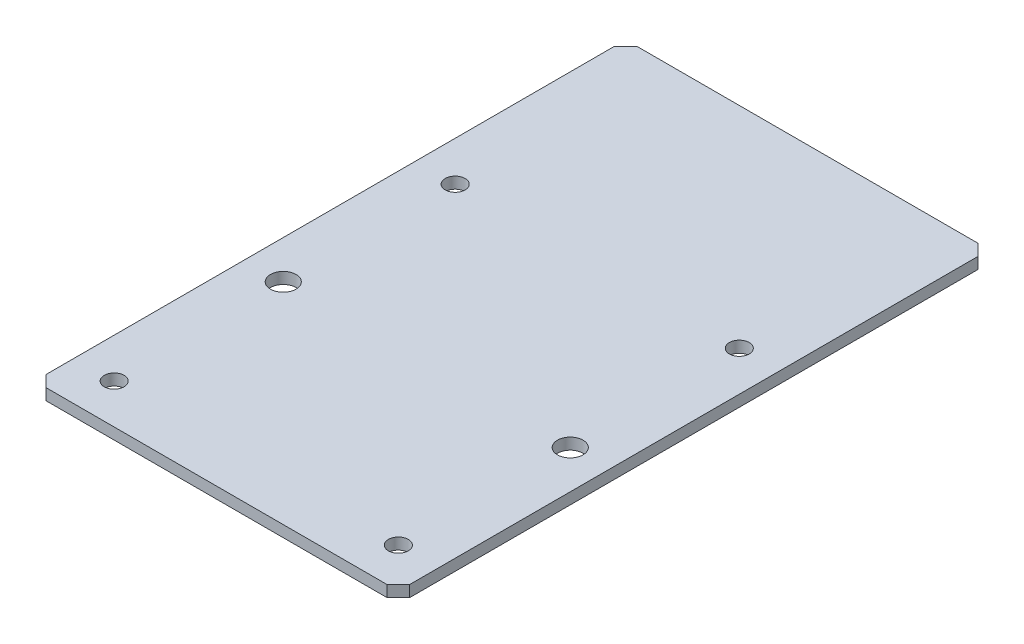
ISO-10303-21;
HEADER;
FILE_DESCRIPTION(('STEP AP214'),'2;1');
FILE_NAME('part.step','',(''),(''),'','','');
FILE_SCHEMA(('AUTOMOTIVE_DESIGN { 1 0 10303 214 1 1 1 1 }'));
ENDSEC;
DATA;
#1=APPLICATION_CONTEXT('core data for automotive mechanical design processes');
#2=APPLICATION_PROTOCOL_DEFINITION('international standard','automotive_design',2000,#1);
#3=PRODUCT_CONTEXT('',#1,'mechanical');
#4=PRODUCT('Part','Part','',(#3));
#5=PRODUCT_RELATED_PRODUCT_CATEGORY('part','',(#4));
#6=PRODUCT_DEFINITION_FORMATION('','',#4);
#7=PRODUCT_DEFINITION_CONTEXT('part definition',#1,'design');
#8=PRODUCT_DEFINITION('design','',#6,#7);
#9=PRODUCT_DEFINITION_SHAPE('','',#8);
#10=(LENGTH_UNIT() NAMED_UNIT(*) SI_UNIT(.MILLI.,.METRE.));
#11=(NAMED_UNIT(*) PLANE_ANGLE_UNIT() SI_UNIT($,.RADIAN.));
#12=(NAMED_UNIT(*) SI_UNIT($,.STERADIAN.) SOLID_ANGLE_UNIT());
#13=UNCERTAINTY_MEASURE_WITH_UNIT(LENGTH_MEASURE(1.E-05),#10,'distance_accuracy_value','');
#14=(GEOMETRIC_REPRESENTATION_CONTEXT(3) GLOBAL_UNCERTAINTY_ASSIGNED_CONTEXT((#13)) GLOBAL_UNIT_ASSIGNED_CONTEXT((#10,
#11,#12)) REPRESENTATION_CONTEXT('',''));
#15=CARTESIAN_POINT('',(0.,0.,0.));
#16=DIRECTION('',(0.,0.,1.));
#17=DIRECTION('',(1.,0.,0.));
#18=AXIS2_PLACEMENT_3D('',#15,#16,#17);
#19=CARTESIAN_POINT('',(-32.,-2.,74.));
#20=DIRECTION('',(0.,1.,0.));
#21=DIRECTION('',(0.,0.,1.));
#22=AXIS2_PLACEMENT_3D('',#19,#20,#21);
#23=PLANE('',#22);
#24=CARTESIAN_POINT('',(25.25,-2.,37.));
#25=DIRECTION('',(0.,1.,0.));
#26=DIRECTION('',(0.,0.,1.));
#27=AXIS2_PLACEMENT_3D('',#24,#25,#26);
#28=CIRCLE('',#27,2.25);
#29=CARTESIAN_POINT('',(25.25,-2.,39.25));
#30=VERTEX_POINT('',#29);
#31=EDGE_CURVE('E291',#30,#30,#28,.F.);
#32=ORIENTED_EDGE('',*,*,#31,.F.);
#33=EDGE_LOOP('',(#32));
#34=FACE_BOUND('',#33,.T.);
#35=CARTESIAN_POINT('',(-25.25,-2.,37.));
#36=DIRECTION('',(0.,1.,0.));
#37=DIRECTION('',(0.,0.,1.));
#38=AXIS2_PLACEMENT_3D('',#35,#36,#37);
#39=CIRCLE('',#38,2.25);
#40=CARTESIAN_POINT('',(-25.25,-2.,39.25));
#41=VERTEX_POINT('',#40);
#42=EDGE_CURVE('E161',#41,#41,#39,.F.);
#43=ORIENTED_EDGE('',*,*,#42,.F.);
#44=EDGE_LOOP('',(#43));
#45=FACE_BOUND('',#44,.T.);
#46=CARTESIAN_POINT('',(25.,-2.,7.00000000000001));
#47=DIRECTION('',(0.,1.,0.));
#48=DIRECTION('',(0.,0.,1.));
#49=AXIS2_PLACEMENT_3D('',#46,#47,#48);
#50=CIRCLE('',#49,1.75);
#51=CARTESIAN_POINT('',(25.,-2.,8.75000000000001));
#52=VERTEX_POINT('',#51);
#53=EDGE_CURVE('E171',#52,#52,#50,.T.);
#54=ORIENTED_EDGE('',*,*,#53,.T.);
#55=EDGE_LOOP('',(#54));
#56=FACE_BOUND('',#55,.T.);
#57=CARTESIAN_POINT('',(25.,-2.,67.));
#58=DIRECTION('',(0.,1.,0.));
#59=DIRECTION('',(0.,0.,1.));
#60=AXIS2_PLACEMENT_3D('',#57,#58,#59);
#61=CIRCLE('',#60,1.75);
#62=CARTESIAN_POINT('',(25.,-2.,68.75));
#63=VERTEX_POINT('',#62);
#64=EDGE_CURVE('E177',#63,#63,#61,.T.);
#65=ORIENTED_EDGE('',*,*,#64,.T.);
#66=EDGE_LOOP('',(#65));
#67=FACE_BOUND('',#66,.T.);
#68=CARTESIAN_POINT('',(-25.,-2.,67.));
#69=DIRECTION('',(0.,1.,0.));
#70=DIRECTION('',(0.,0.,1.));
#71=AXIS2_PLACEMENT_3D('',#68,#69,#70);
#72=CIRCLE('',#71,1.75);
#73=CARTESIAN_POINT('',(-25.,-2.,68.75));
#74=VERTEX_POINT('',#73);
#75=EDGE_CURVE('E183',#74,#74,#72,.T.);
#76=ORIENTED_EDGE('',*,*,#75,.T.);
#77=EDGE_LOOP('',(#76));
#78=FACE_BOUND('',#77,.T.);
#79=CARTESIAN_POINT('',(-25.,-2.,7.00000000000001));
#80=DIRECTION('',(0.,1.,0.));
#81=DIRECTION('',(0.,0.,1.));
#82=AXIS2_PLACEMENT_3D('',#79,#80,#81);
#83=CIRCLE('',#82,1.75);
#84=CARTESIAN_POINT('',(-25.,-2.,8.75000000000001));
#85=VERTEX_POINT('',#84);
#86=EDGE_CURVE('E189',#85,#85,#83,.T.);
#87=ORIENTED_EDGE('',*,*,#86,.T.);
#88=EDGE_LOOP('',(#87));
#89=FACE_BOUND('',#88,.T.);
#90=DIRECTION('',(-1.,0.,0.));
#91=VECTOR('',#90,1.);
#92=CARTESIAN_POINT('',(-32.,-2.,-30.));
#93=LINE('',#92,#91);
#94=CARTESIAN_POINT('',(30.,-2.,-30.));
#95=VERTEX_POINT('',#94);
#96=CARTESIAN_POINT('',(-30.,-2.,-30.));
#97=VERTEX_POINT('',#96);
#98=EDGE_CURVE('E151',#95,#97,#93,.T.);
#99=ORIENTED_EDGE('',*,*,#98,.F.);
#100=DIRECTION('',(-0.707106781186548,0.,-0.707106781186548));
#101=VECTOR('',#100,1.);
#102=CARTESIAN_POINT('',(32.,-2.,-28.));
#103=LINE('',#102,#101);
#104=CARTESIAN_POINT('',(32.,-2.,-28.));
#105=VERTEX_POINT('',#104);
#106=EDGE_CURVE('E42',#95,#105,#103,.F.);
#107=ORIENTED_EDGE('',*,*,#106,.T.);
#108=DIRECTION('',(0.,0.,-1.));
#109=VECTOR('',#108,1.);
#110=CARTESIAN_POINT('',(32.,-2.,74.));
#111=LINE('',#110,#109);
#112=CARTESIAN_POINT('',(32.,-2.,72.));
#113=VERTEX_POINT('',#112);
#114=EDGE_CURVE('E122',#113,#105,#111,.T.);
#115=ORIENTED_EDGE('',*,*,#114,.F.);
#116=DIRECTION('',(-0.70710678118655,0.,0.707106781186545));
#117=VECTOR('',#116,1.);
#118=CARTESIAN_POINT('',(32.,-2.,72.));
#119=LINE('',#118,#117);
#120=CARTESIAN_POINT('',(30.,-2.,74.));
#121=VERTEX_POINT('',#120);
#122=EDGE_CURVE('E126',#113,#121,#119,.T.);
#123=ORIENTED_EDGE('',*,*,#122,.T.);
#124=DIRECTION('',(1.,0.,0.));
#125=VECTOR('',#124,1.);
#126=CARTESIAN_POINT('',(-32.,-2.,74.));
#127=LINE('',#126,#125);
#128=CARTESIAN_POINT('',(-30.,-2.,74.));
#129=VERTEX_POINT('',#128);
#130=EDGE_CURVE('E192',#129,#121,#127,.T.);
#131=ORIENTED_EDGE('',*,*,#130,.F.);
#132=DIRECTION('',(-0.70710678118655,0.,-0.707106781186545));
#133=VECTOR('',#132,1.);
#134=CARTESIAN_POINT('',(-32.,-2.,72.));
#135=LINE('',#134,#133);
#136=CARTESIAN_POINT('',(-32.,-2.,72.));
#137=VERTEX_POINT('',#136);
#138=EDGE_CURVE('E127',#129,#137,#135,.T.);
#139=ORIENTED_EDGE('',*,*,#138,.T.);
#140=DIRECTION('',(0.,0.,-1.));
#141=VECTOR('',#140,1.);
#142=CARTESIAN_POINT('',(-32.,-2.,74.));
#143=LINE('',#142,#141);
#144=CARTESIAN_POINT('',(-32.,-2.,-28.));
#145=VERTEX_POINT('',#144);
#146=EDGE_CURVE('E196',#137,#145,#143,.T.);
#147=ORIENTED_EDGE('',*,*,#146,.T.);
#148=DIRECTION('',(-0.707106781186548,0.,0.707106781186548));
#149=VECTOR('',#148,1.);
#150=CARTESIAN_POINT('',(-30.,-2.,-30.));
#151=LINE('',#150,#149);
#152=EDGE_CURVE('E54',#145,#97,#151,.F.);
#153=ORIENTED_EDGE('',*,*,#152,.T.);
#154=EDGE_LOOP('',(#99,#107,#115,#123,#131,#139,#147,#153));
#155=FACE_BOUND('',#154,.T.);
#156=ADVANCED_FACE('F34',(#34,#45,#56,#67,#78,#89,#155),#23,.F.);
#157=CARTESIAN_POINT('',(32.,0.,74.));
#158=DIRECTION('',(1.,0.,0.));
#159=DIRECTION('',(0.,0.,-1.));
#160=AXIS2_PLACEMENT_3D('',#157,#158,#159);
#161=PLANE('',#160);
#162=ORIENTED_EDGE('',*,*,#114,.T.);
#163=DIRECTION('',(0.,1.,0.));
#164=VECTOR('',#163,1.);
#165=CARTESIAN_POINT('',(32.,0.,-28.));
#166=LINE('',#165,#164);
#167=CARTESIAN_POINT('',(32.,0.,-28.));
#168=VERTEX_POINT('',#167);
#169=EDGE_CURVE('E121',#105,#168,#166,.T.);
#170=ORIENTED_EDGE('',*,*,#169,.T.);
#171=DIRECTION('',(0.,0.,-1.));
#172=VECTOR('',#171,1.);
#173=CARTESIAN_POINT('',(32.,0.,74.));
#174=LINE('',#173,#172);
#175=CARTESIAN_POINT('',(32.,0.,72.));
#176=VERTEX_POINT('',#175);
#177=EDGE_CURVE('E104',#176,#168,#174,.T.);
#178=ORIENTED_EDGE('',*,*,#177,.F.);
#179=DIRECTION('',(0.,-1.,0.));
#180=VECTOR('',#179,1.);
#181=CARTESIAN_POINT('',(32.,-2.,72.));
#182=LINE('',#181,#180);
#183=EDGE_CURVE('E118',#176,#113,#182,.T.);
#184=ORIENTED_EDGE('',*,*,#183,.T.);
#185=EDGE_LOOP('',(#162,#170,#178,#184));
#186=FACE_BOUND('',#185,.T.);
#187=ADVANCED_FACE('F117',(#186),#161,.T.);
#188=CARTESIAN_POINT('',(-32.,0.,74.));
#189=DIRECTION('',(0.,1.,0.));
#190=DIRECTION('',(0.,0.,1.));
#191=AXIS2_PLACEMENT_3D('',#188,#189,#190);
#192=PLANE('',#191);
#193=CARTESIAN_POINT('',(25.25,0.,37.));
#194=DIRECTION('',(0.,1.,0.));
#195=DIRECTION('',(0.,0.,1.));
#196=AXIS2_PLACEMENT_3D('',#193,#194,#195);
#197=CIRCLE('',#196,2.25);
#198=CARTESIAN_POINT('',(25.25,0.,39.25));
#199=VERTEX_POINT('',#198);
#200=EDGE_CURVE('E256',#199,#199,#197,.T.);
#201=ORIENTED_EDGE('',*,*,#200,.F.);
#202=EDGE_LOOP('',(#201));
#203=FACE_BOUND('',#202,.T.);
#204=CARTESIAN_POINT('',(-25.25,0.,37.));
#205=DIRECTION('',(0.,1.,0.));
#206=DIRECTION('',(0.,0.,1.));
#207=AXIS2_PLACEMENT_3D('',#204,#205,#206);
#208=CIRCLE('',#207,2.25);
#209=CARTESIAN_POINT('',(-25.25,0.,39.25));
#210=VERTEX_POINT('',#209);
#211=EDGE_CURVE('E166',#210,#210,#208,.T.);
#212=ORIENTED_EDGE('',*,*,#211,.F.);
#213=EDGE_LOOP('',(#212));
#214=FACE_BOUND('',#213,.T.);
#215=CARTESIAN_POINT('',(25.,0.,7.00000000000001));
#216=DIRECTION('',(0.,1.,0.));
#217=DIRECTION('',(0.,0.,-1.));
#218=AXIS2_PLACEMENT_3D('',#215,#216,#217);
#219=CIRCLE('',#218,1.75);
#220=CARTESIAN_POINT('',(25.,0.,5.25000000000001));
#221=VERTEX_POINT('',#220);
#222=EDGE_CURVE('E163',#221,#221,#219,.T.);
#223=ORIENTED_EDGE('',*,*,#222,.F.);
#224=EDGE_LOOP('',(#223));
#225=FACE_BOUND('',#224,.T.);
#226=CARTESIAN_POINT('',(25.,0.,67.));
#227=DIRECTION('',(0.,1.,0.));
#228=DIRECTION('',(0.,0.,1.));
#229=AXIS2_PLACEMENT_3D('',#226,#227,#228);
#230=CIRCLE('',#229,1.75);
#231=CARTESIAN_POINT('',(25.,0.,68.75));
#232=VERTEX_POINT('',#231);
#233=EDGE_CURVE('E174',#232,#232,#230,.T.);
#234=ORIENTED_EDGE('',*,*,#233,.F.);
#235=EDGE_LOOP('',(#234));
#236=FACE_BOUND('',#235,.T.);
#237=CARTESIAN_POINT('',(-25.,0.,67.));
#238=DIRECTION('',(0.,1.,0.));
#239=DIRECTION('',(0.,0.,-1.));
#240=AXIS2_PLACEMENT_3D('',#237,#238,#239);
#241=CIRCLE('',#240,1.75);
#242=CARTESIAN_POINT('',(-25.,0.,65.25));
#243=VERTEX_POINT('',#242);
#244=EDGE_CURVE('E180',#243,#243,#241,.T.);
#245=ORIENTED_EDGE('',*,*,#244,.F.);
#246=EDGE_LOOP('',(#245));
#247=FACE_BOUND('',#246,.T.);
#248=CARTESIAN_POINT('',(-25.,0.,7.00000000000001));
#249=DIRECTION('',(0.,1.,0.));
#250=DIRECTION('',(0.,0.,1.));
#251=AXIS2_PLACEMENT_3D('',#248,#249,#250);
#252=CIRCLE('',#251,1.75);
#253=CARTESIAN_POINT('',(-25.,0.,8.75000000000001));
#254=VERTEX_POINT('',#253);
#255=EDGE_CURVE('E186',#254,#254,#252,.T.);
#256=ORIENTED_EDGE('',*,*,#255,.F.);
#257=EDGE_LOOP('',(#256));
#258=FACE_BOUND('',#257,.T.);
#259=ORIENTED_EDGE('',*,*,#177,.T.);
#260=DIRECTION('',(0.707106781186548,0.,0.707106781186548));
#261=VECTOR('',#260,1.);
#262=CARTESIAN_POINT('',(51.,0.,-9.00000000000001));
#263=LINE('',#262,#261);
#264=CARTESIAN_POINT('',(30.,0.,-30.));
#265=VERTEX_POINT('',#264);
#266=EDGE_CURVE('E143',#168,#265,#263,.F.);
#267=ORIENTED_EDGE('',*,*,#266,.T.);
#268=DIRECTION('',(-1.,0.,0.));
#269=VECTOR('',#268,1.);
#270=CARTESIAN_POINT('',(-32.,0.,-30.));
#271=LINE('',#270,#269);
#272=CARTESIAN_POINT('',(-30.,0.,-30.));
#273=VERTEX_POINT('',#272);
#274=EDGE_CURVE('E157',#265,#273,#271,.T.);
#275=ORIENTED_EDGE('',*,*,#274,.T.);
#276=DIRECTION('',(0.707106781186548,0.,-0.707106781186548));
#277=VECTOR('',#276,1.);
#278=CARTESIAN_POINT('',(-83.,0.,23.));
#279=LINE('',#278,#277);
#280=CARTESIAN_POINT('',(-32.,0.,-28.));
#281=VERTEX_POINT('',#280);
#282=EDGE_CURVE('E141',#273,#281,#279,.F.);
#283=ORIENTED_EDGE('',*,*,#282,.T.);
#284=DIRECTION('',(0.,0.,-1.));
#285=VECTOR('',#284,1.);
#286=CARTESIAN_POINT('',(-32.,0.,74.));
#287=LINE('',#286,#285);
#288=CARTESIAN_POINT('',(-32.,0.,72.));
#289=VERTEX_POINT('',#288);
#290=EDGE_CURVE('E123',#289,#281,#287,.T.);
#291=ORIENTED_EDGE('',*,*,#290,.F.);
#292=DIRECTION('',(0.70710678118655,0.,0.707106781186545));
#293=VECTOR('',#292,1.);
#294=CARTESIAN_POINT('',(-31.,0.,73.));
#295=LINE('',#294,#293);
#296=CARTESIAN_POINT('',(-30.,0.,74.));
#297=VERTEX_POINT('',#296);
#298=EDGE_CURVE('E111',#289,#297,#295,.T.);
#299=ORIENTED_EDGE('',*,*,#298,.T.);
#300=DIRECTION('',(1.,0.,0.));
#301=VECTOR('',#300,1.);
#302=CARTESIAN_POINT('',(-32.,0.,74.));
#303=LINE('',#302,#301);
#304=CARTESIAN_POINT('',(30.,0.,74.));
#305=VERTEX_POINT('',#304);
#306=EDGE_CURVE('E106',#297,#305,#303,.T.);
#307=ORIENTED_EDGE('',*,*,#306,.T.);
#308=DIRECTION('',(0.70710678118655,0.,-0.707106781186545));
#309=VECTOR('',#308,1.);
#310=CARTESIAN_POINT('',(-1.00000000000023,0.,105.));
#311=LINE('',#310,#309);
#312=EDGE_CURVE('E101',#305,#176,#311,.T.);
#313=ORIENTED_EDGE('',*,*,#312,.T.);
#314=EDGE_LOOP('',(#259,#267,#275,#283,#291,#299,#307,#313));
#315=FACE_BOUND('',#314,.T.);
#316=ADVANCED_FACE('F103',(#203,#214,#225,#236,#247,#258,#315),#192,.T.);
#317=CARTESIAN_POINT('',(-32.,-2.,74.));
#318=DIRECTION('',(-1.,0.,0.));
#319=DIRECTION('',(0.,0.,1.));
#320=AXIS2_PLACEMENT_3D('',#317,#318,#319);
#321=PLANE('',#320);
#322=ORIENTED_EDGE('',*,*,#290,.T.);
#323=DIRECTION('',(0.,-1.,0.));
#324=VECTOR('',#323,1.);
#325=CARTESIAN_POINT('',(-32.,-2.,-28.));
#326=LINE('',#325,#324);
#327=EDGE_CURVE('E11',#281,#145,#326,.T.);
#328=ORIENTED_EDGE('',*,*,#327,.T.);
#329=ORIENTED_EDGE('',*,*,#146,.F.);
#330=DIRECTION('',(0.,1.,0.));
#331=VECTOR('',#330,1.);
#332=CARTESIAN_POINT('',(-32.,0.,72.));
#333=LINE('',#332,#331);
#334=EDGE_CURVE('E110',#137,#289,#333,.T.);
#335=ORIENTED_EDGE('',*,*,#334,.T.);
#336=EDGE_LOOP('',(#322,#328,#329,#335));
#337=FACE_BOUND('',#336,.T.);
#338=ADVANCED_FACE('F199',(#337),#321,.T.);
#339=CARTESIAN_POINT('',(32.,-2.,74.));
#340=DIRECTION('',(0.,0.,-1.));
#341=DIRECTION('',(-1.,0.,0.));
#342=AXIS2_PLACEMENT_3D('',#339,#340,#341);
#343=PLANE('',#342);
#344=ORIENTED_EDGE('',*,*,#130,.T.);
#345=DIRECTION('',(0.,1.,0.));
#346=VECTOR('',#345,1.);
#347=CARTESIAN_POINT('',(30.,0.,74.));
#348=LINE('',#347,#346);
#349=EDGE_CURVE('E135',#121,#305,#348,.T.);
#350=ORIENTED_EDGE('',*,*,#349,.T.);
#351=ORIENTED_EDGE('',*,*,#306,.F.);
#352=DIRECTION('',(0.,-1.,0.));
#353=VECTOR('',#352,1.);
#354=CARTESIAN_POINT('',(-30.,-2.,74.));
#355=LINE('',#354,#353);
#356=EDGE_CURVE('E133',#297,#129,#355,.T.);
#357=ORIENTED_EDGE('',*,*,#356,.T.);
#358=EDGE_LOOP('',(#344,#350,#351,#357));
#359=FACE_BOUND('',#358,.T.);
#360=ADVANCED_FACE('F236',(#359),#343,.F.);
#361=CARTESIAN_POINT('',(-25.,-10.,7.00000000000001));
#362=DIRECTION('',(0.,1.,0.));
#363=DIRECTION('',(0.,0.,1.));
#364=AXIS2_PLACEMENT_3D('',#361,#362,#363);
#365=CYLINDRICAL_SURFACE('',#364,1.75);
#366=ORIENTED_EDGE('',*,*,#255,.T.);
#367=EDGE_LOOP('',(#366));
#368=FACE_BOUND('',#367,.T.);
#369=ORIENTED_EDGE('',*,*,#86,.F.);
#370=EDGE_LOOP('',(#369));
#371=FACE_BOUND('',#370,.T.);
#372=ADVANCED_FACE('F238',(#368,#371),#365,.F.);
#373=CARTESIAN_POINT('',(-25.,-10.,67.));
#374=DIRECTION('',(0.,1.,0.));
#375=DIRECTION('',(0.,0.,1.));
#376=AXIS2_PLACEMENT_3D('',#373,#374,#375);
#377=CYLINDRICAL_SURFACE('',#376,1.75);
#378=ORIENTED_EDGE('',*,*,#244,.T.);
#379=EDGE_LOOP('',(#378));
#380=FACE_BOUND('',#379,.T.);
#381=ORIENTED_EDGE('',*,*,#75,.F.);
#382=EDGE_LOOP('',(#381));
#383=FACE_BOUND('',#382,.T.);
#384=ADVANCED_FACE('F244',(#380,#383),#377,.F.);
#385=CARTESIAN_POINT('',(25.,-10.,67.));
#386=DIRECTION('',(0.,1.,0.));
#387=DIRECTION('',(0.,0.,1.));
#388=AXIS2_PLACEMENT_3D('',#385,#386,#387);
#389=CYLINDRICAL_SURFACE('',#388,1.75);
#390=ORIENTED_EDGE('',*,*,#233,.T.);
#391=EDGE_LOOP('',(#390));
#392=FACE_BOUND('',#391,.T.);
#393=ORIENTED_EDGE('',*,*,#64,.F.);
#394=EDGE_LOOP('',(#393));
#395=FACE_BOUND('',#394,.T.);
#396=ADVANCED_FACE('F273',(#392,#395),#389,.F.);
#397=CARTESIAN_POINT('',(25.,-10.,7.00000000000001));
#398=DIRECTION('',(0.,1.,0.));
#399=DIRECTION('',(0.,0.,1.));
#400=AXIS2_PLACEMENT_3D('',#397,#398,#399);
#401=CYLINDRICAL_SURFACE('',#400,1.75);
#402=ORIENTED_EDGE('',*,*,#222,.T.);
#403=EDGE_LOOP('',(#402));
#404=FACE_BOUND('',#403,.T.);
#405=ORIENTED_EDGE('',*,*,#53,.F.);
#406=EDGE_LOOP('',(#405));
#407=FACE_BOUND('',#406,.T.);
#408=ADVANCED_FACE('F225',(#404,#407),#401,.F.);
#409=CARTESIAN_POINT('',(32.,0.,72.));
#410=DIRECTION('',(0.707106781186545,0.,0.70710678118655));
#411=DIRECTION('',(0.70710678118655,0.,-0.707106781186545));
#412=AXIS2_PLACEMENT_3D('',#409,#410,#411);
#413=PLANE('',#412);
#414=ORIENTED_EDGE('',*,*,#312,.F.);
#415=ORIENTED_EDGE('',*,*,#349,.F.);
#416=ORIENTED_EDGE('',*,*,#122,.F.);
#417=ORIENTED_EDGE('',*,*,#183,.F.);
#418=EDGE_LOOP('',(#414,#415,#416,#417));
#419=FACE_BOUND('',#418,.T.);
#420=ADVANCED_FACE('F125',(#419),#413,.T.);
#421=CARTESIAN_POINT('',(-32.,-2.,72.));
#422=DIRECTION('',(-0.707106781186545,0.,0.70710678118655));
#423=DIRECTION('',(0.70710678118655,0.,0.707106781186545));
#424=AXIS2_PLACEMENT_3D('',#421,#422,#423);
#425=PLANE('',#424);
#426=ORIENTED_EDGE('',*,*,#138,.F.);
#427=ORIENTED_EDGE('',*,*,#356,.F.);
#428=ORIENTED_EDGE('',*,*,#298,.F.);
#429=ORIENTED_EDGE('',*,*,#334,.F.);
#430=EDGE_LOOP('',(#426,#427,#428,#429));
#431=FACE_BOUND('',#430,.T.);
#432=ADVANCED_FACE('F224',(#431),#425,.T.);
#433=CARTESIAN_POINT('',(-32.,-2.,-30.));
#434=DIRECTION('',(0.,0.,-1.));
#435=DIRECTION('',(-1.,0.,0.));
#436=AXIS2_PLACEMENT_3D('',#433,#434,#435);
#437=PLANE('',#436);
#438=ORIENTED_EDGE('',*,*,#274,.F.);
#439=DIRECTION('',(0.,-1.,0.));
#440=VECTOR('',#439,1.);
#441=CARTESIAN_POINT('',(30.,-2.,-30.));
#442=LINE('',#441,#440);
#443=EDGE_CURVE('E148',#265,#95,#442,.T.);
#444=ORIENTED_EDGE('',*,*,#443,.T.);
#445=ORIENTED_EDGE('',*,*,#98,.T.);
#446=DIRECTION('',(0.,1.,0.));
#447=VECTOR('',#446,1.);
#448=CARTESIAN_POINT('',(-30.,-2.,-30.));
#449=LINE('',#448,#447);
#450=EDGE_CURVE('E145',#97,#273,#449,.T.);
#451=ORIENTED_EDGE('',*,*,#450,.T.);
#452=EDGE_LOOP('',(#438,#444,#445,#451));
#453=FACE_BOUND('',#452,.T.);
#454=ADVANCED_FACE('F159',(#453),#437,.T.);
#455=CARTESIAN_POINT('',(32.,0.,-28.));
#456=DIRECTION('',(-0.707106781186547,0.,0.707106781186547));
#457=DIRECTION('',(0.707106781186548,0.,0.707106781186548));
#458=AXIS2_PLACEMENT_3D('',#455,#456,#457);
#459=PLANE('',#458);
#460=ORIENTED_EDGE('',*,*,#106,.F.);
#461=ORIENTED_EDGE('',*,*,#443,.F.);
#462=ORIENTED_EDGE('',*,*,#266,.F.);
#463=ORIENTED_EDGE('',*,*,#169,.F.);
#464=EDGE_LOOP('',(#460,#461,#462,#463));
#465=FACE_BOUND('',#464,.T.);
#466=ADVANCED_FACE('F154',(#465),#459,.F.);
#467=CARTESIAN_POINT('',(-30.,-2.,-30.));
#468=DIRECTION('',(0.707106781186547,0.,0.707106781186547));
#469=DIRECTION('',(0.707106781186548,0.,-0.707106781186548));
#470=AXIS2_PLACEMENT_3D('',#467,#468,#469);
#471=PLANE('',#470);
#472=ORIENTED_EDGE('',*,*,#152,.F.);
#473=ORIENTED_EDGE('',*,*,#327,.F.);
#474=ORIENTED_EDGE('',*,*,#282,.F.);
#475=ORIENTED_EDGE('',*,*,#450,.F.);
#476=EDGE_LOOP('',(#472,#473,#474,#475));
#477=FACE_BOUND('',#476,.T.);
#478=ADVANCED_FACE('F36',(#477),#471,.F.);
#479=CARTESIAN_POINT('',(-25.25,-2.001,37.));
#480=DIRECTION('',(0.,1.,0.));
#481=DIRECTION('',(0.,0.,1.));
#482=AXIS2_PLACEMENT_3D('',#479,#480,#481);
#483=CYLINDRICAL_SURFACE('',#482,2.25);
#484=ORIENTED_EDGE('',*,*,#211,.T.);
#485=EDGE_LOOP('',(#484));
#486=FACE_BOUND('',#485,.T.);
#487=ORIENTED_EDGE('',*,*,#42,.T.);
#488=EDGE_LOOP('',(#487));
#489=FACE_BOUND('',#488,.T.);
#490=ADVANCED_FACE('F203',(#486,#489),#483,.F.);
#491=CARTESIAN_POINT('',(25.25,-2.001,37.));
#492=DIRECTION('',(0.,1.,0.));
#493=DIRECTION('',(0.,0.,1.));
#494=AXIS2_PLACEMENT_3D('',#491,#492,#493);
#495=CYLINDRICAL_SURFACE('',#494,2.25);
#496=ORIENTED_EDGE('',*,*,#200,.T.);
#497=EDGE_LOOP('',(#496));
#498=FACE_BOUND('',#497,.T.);
#499=ORIENTED_EDGE('',*,*,#31,.T.);
#500=EDGE_LOOP('',(#499));
#501=FACE_BOUND('',#500,.T.);
#502=ADVANCED_FACE('F208',(#498,#501),#495,.F.);
#503=CLOSED_SHELL('',(#156,#187,#316,#338,#360,#372,#384,#396,#408,#420,#432,#454,#466,#478,
#490,#502));
#504=MANIFOLD_SOLID_BREP('B2',#503);
#505=ADVANCED_BREP_SHAPE_REPRESENTATION('',(#18,#504),#14);
#506=SHAPE_DEFINITION_REPRESENTATION(#9,#505);
ENDSEC;
END-ISO-10303-21;
